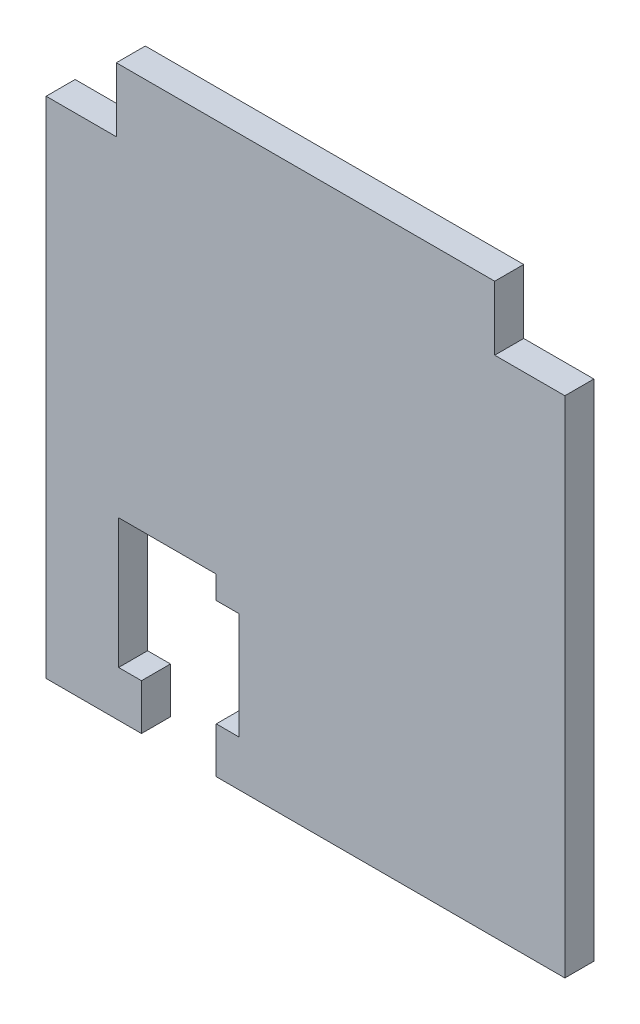
ISO-10303-21;
HEADER;
FILE_DESCRIPTION(('STEP AP214'),'2;1');
FILE_NAME('part.step','',(''),(''),'','','');
FILE_SCHEMA(('AUTOMOTIVE_DESIGN { 1 0 10303 214 1 1 1 1 }'));
ENDSEC;
DATA;
#1=APPLICATION_CONTEXT('core data for automotive mechanical design processes');
#2=APPLICATION_PROTOCOL_DEFINITION('international standard','automotive_design',2000,#1);
#3=PRODUCT_CONTEXT('',#1,'mechanical');
#4=PRODUCT('Part','Part','',(#3));
#5=PRODUCT_RELATED_PRODUCT_CATEGORY('part','',(#4));
#6=PRODUCT_DEFINITION_FORMATION('','',#4);
#7=PRODUCT_DEFINITION_CONTEXT('part definition',#1,'design');
#8=PRODUCT_DEFINITION('design','',#6,#7);
#9=PRODUCT_DEFINITION_SHAPE('','',#8);
#10=(LENGTH_UNIT() NAMED_UNIT(*) SI_UNIT(.MILLI.,.METRE.));
#11=(NAMED_UNIT(*) PLANE_ANGLE_UNIT() SI_UNIT($,.RADIAN.));
#12=(NAMED_UNIT(*) SI_UNIT($,.STERADIAN.) SOLID_ANGLE_UNIT());
#13=UNCERTAINTY_MEASURE_WITH_UNIT(LENGTH_MEASURE(1.E-05),#10,'distance_accuracy_value','');
#14=(GEOMETRIC_REPRESENTATION_CONTEXT(3) GLOBAL_UNCERTAINTY_ASSIGNED_CONTEXT((#13)) GLOBAL_UNIT_ASSIGNED_CONTEXT((#10,
#11,#12)) REPRESENTATION_CONTEXT('',''));
#15=CARTESIAN_POINT('',(0.,0.,0.));
#16=DIRECTION('',(0.,0.,1.));
#17=DIRECTION('',(1.,0.,0.));
#18=AXIS2_PLACEMENT_3D('',#15,#16,#17);
#19=CARTESIAN_POINT('',(-170.,-186.25,19.));
#20=DIRECTION('',(0.,1.,0.));
#21=DIRECTION('',(0.,0.,1.));
#22=AXIS2_PLACEMENT_3D('',#19,#20,#21);
#23=PLANE('',#22);
#24=DIRECTION('',(1.,0.,0.));
#25=VECTOR('',#24,1.);
#26=CARTESIAN_POINT('',(-170.,-186.25,19.));
#27=LINE('',#26,#25);
#28=CARTESIAN_POINT('',(-58.5,-186.25,19.));
#29=VERTEX_POINT('',#28);
#30=CARTESIAN_POINT('',(170.,-186.25,19.));
#31=VERTEX_POINT('',#30);
#32=EDGE_CURVE('E189',#29,#31,#27,.T.);
#33=ORIENTED_EDGE('',*,*,#32,.F.);
#34=DIRECTION('',(0.,0.,1.));
#35=VECTOR('',#34,1.);
#36=CARTESIAN_POINT('',(-58.5,-186.25,-0.99999999999997));
#37=LINE('',#36,#35);
#38=CARTESIAN_POINT('',(-58.5,-186.25,0.));
#39=VERTEX_POINT('',#38);
#40=EDGE_CURVE('E181',#39,#29,#37,.T.);
#41=ORIENTED_EDGE('',*,*,#40,.F.);
#42=DIRECTION('',(1.,0.,0.));
#43=VECTOR('',#42,1.);
#44=CARTESIAN_POINT('',(-170.,-186.25,0.));
#45=LINE('',#44,#43);
#46=CARTESIAN_POINT('',(170.,-186.25,0.));
#47=VERTEX_POINT('',#46);
#48=EDGE_CURVE('E206',#39,#47,#45,.T.);
#49=ORIENTED_EDGE('',*,*,#48,.T.);
#50=DIRECTION('',(0.,0.,-1.));
#51=VECTOR('',#50,1.);
#52=CARTESIAN_POINT('',(170.,-186.25,19.));
#53=LINE('',#52,#51);
#54=EDGE_CURVE('E188',#31,#47,#53,.T.);
#55=ORIENTED_EDGE('',*,*,#54,.F.);
#56=EDGE_LOOP('',(#33,#41,#49,#55));
#57=FACE_BOUND('',#56,.T.);
#58=ADVANCED_FACE('F38',(#57),#23,.F.);
#59=CARTESIAN_POINT('',(170.,-186.25,19.));
#60=DIRECTION('',(-1.,0.,0.));
#61=DIRECTION('',(0.,0.,1.));
#62=AXIS2_PLACEMENT_3D('',#59,#60,#61);
#63=PLANE('',#62);
#64=DIRECTION('',(0.,1.,0.));
#65=VECTOR('',#64,1.);
#66=CARTESIAN_POINT('',(170.,-186.25,0.));
#67=LINE('',#66,#65);
#68=CARTESIAN_POINT('',(170.,144.25,0.));
#69=VERTEX_POINT('',#68);
#70=EDGE_CURVE('E197',#47,#69,#67,.T.);
#71=ORIENTED_EDGE('',*,*,#70,.T.);
#72=DIRECTION('',(0.,0.,1.));
#73=VECTOR('',#72,1.);
#74=CARTESIAN_POINT('',(170.,144.25,0.));
#75=LINE('',#74,#73);
#76=CARTESIAN_POINT('',(170.,144.25,19.));
#77=VERTEX_POINT('',#76);
#78=EDGE_CURVE('E254',#69,#77,#75,.T.);
#79=ORIENTED_EDGE('',*,*,#78,.T.);
#80=DIRECTION('',(0.,1.,0.));
#81=VECTOR('',#80,1.);
#82=CARTESIAN_POINT('',(170.,-186.25,19.));
#83=LINE('',#82,#81);
#84=EDGE_CURVE('E207',#31,#77,#83,.T.);
#85=ORIENTED_EDGE('',*,*,#84,.F.);
#86=ORIENTED_EDGE('',*,*,#54,.T.);
#87=EDGE_LOOP('',(#71,#79,#85,#86));
#88=FACE_BOUND('',#87,.T.);
#89=ADVANCED_FACE('F40',(#88),#63,.F.);
#90=CARTESIAN_POINT('',(-170.,186.25,19.));
#91=DIRECTION('',(0.,-1.,0.));
#92=DIRECTION('',(0.,0.,-1.));
#93=AXIS2_PLACEMENT_3D('',#90,#91,#92);
#94=PLANE('',#93);
#95=DIRECTION('',(-1.,0.,0.));
#96=VECTOR('',#95,1.);
#97=CARTESIAN_POINT('',(-170.,186.25,0.));
#98=LINE('',#97,#96);
#99=CARTESIAN_POINT('',(124.,186.25,0.));
#100=VERTEX_POINT('',#99);
#101=CARTESIAN_POINT('',(-124.,186.25,0.));
#102=VERTEX_POINT('',#101);
#103=EDGE_CURVE('E200',#100,#102,#98,.T.);
#104=ORIENTED_EDGE('',*,*,#103,.T.);
#105=DIRECTION('',(0.,0.,1.));
#106=VECTOR('',#105,1.);
#107=CARTESIAN_POINT('',(-124.,186.25,0.));
#108=LINE('',#107,#106);
#109=CARTESIAN_POINT('',(-124.,186.25,19.));
#110=VERTEX_POINT('',#109);
#111=EDGE_CURVE('E201',#102,#110,#108,.T.);
#112=ORIENTED_EDGE('',*,*,#111,.T.);
#113=DIRECTION('',(-1.,0.,0.));
#114=VECTOR('',#113,1.);
#115=CARTESIAN_POINT('',(-170.,186.25,19.));
#116=LINE('',#115,#114);
#117=CARTESIAN_POINT('',(124.,186.25,19.));
#118=VERTEX_POINT('',#117);
#119=EDGE_CURVE('E290',#118,#110,#116,.T.);
#120=ORIENTED_EDGE('',*,*,#119,.F.);
#121=DIRECTION('',(0.,0.,1.));
#122=VECTOR('',#121,1.);
#123=CARTESIAN_POINT('',(124.,186.25,0.));
#124=LINE('',#123,#122);
#125=EDGE_CURVE('E273',#100,#118,#124,.T.);
#126=ORIENTED_EDGE('',*,*,#125,.F.);
#127=EDGE_LOOP('',(#104,#112,#120,#126));
#128=FACE_BOUND('',#127,.T.);
#129=ADVANCED_FACE('F298',(#128),#94,.F.);
#130=CARTESIAN_POINT('',(-170.,-186.25,19.));
#131=DIRECTION('',(1.,0.,0.));
#132=DIRECTION('',(0.,0.,-1.));
#133=AXIS2_PLACEMENT_3D('',#130,#131,#132);
#134=PLANE('',#133);
#135=DIRECTION('',(0.,-1.,0.));
#136=VECTOR('',#135,1.);
#137=CARTESIAN_POINT('',(-170.,-186.25,19.));
#138=LINE('',#137,#136);
#139=CARTESIAN_POINT('',(-170.,144.25,19.));
#140=VERTEX_POINT('',#139);
#141=CARTESIAN_POINT('',(-170.,-186.25,19.));
#142=VERTEX_POINT('',#141);
#143=EDGE_CURVE('E186',#140,#142,#138,.T.);
#144=ORIENTED_EDGE('',*,*,#143,.F.);
#145=DIRECTION('',(0.,0.,1.));
#146=VECTOR('',#145,1.);
#147=CARTESIAN_POINT('',(-170.,144.25,0.));
#148=LINE('',#147,#146);
#149=CARTESIAN_POINT('',(-170.,144.25,0.));
#150=VERTEX_POINT('',#149);
#151=EDGE_CURVE('E262',#150,#140,#148,.T.);
#152=ORIENTED_EDGE('',*,*,#151,.F.);
#153=DIRECTION('',(0.,-1.,0.));
#154=VECTOR('',#153,1.);
#155=CARTESIAN_POINT('',(-170.,-186.25,0.));
#156=LINE('',#155,#154);
#157=CARTESIAN_POINT('',(-170.,-186.25,0.));
#158=VERTEX_POINT('',#157);
#159=EDGE_CURVE('E204',#150,#158,#156,.T.);
#160=ORIENTED_EDGE('',*,*,#159,.T.);
#161=DIRECTION('',(0.,0.,-1.));
#162=VECTOR('',#161,1.);
#163=CARTESIAN_POINT('',(-170.,-186.25,19.));
#164=LINE('',#163,#162);
#165=EDGE_CURVE('E192',#142,#158,#164,.T.);
#166=ORIENTED_EDGE('',*,*,#165,.F.);
#167=EDGE_LOOP('',(#144,#152,#160,#166));
#168=FACE_BOUND('',#167,.T.);
#169=ADVANCED_FACE('F308',(#168),#134,.F.);
#170=CARTESIAN_POINT('',(-107.5,-186.25,0.));
#171=VERTEX_POINT('',#170);
#172=EDGE_CURVE('E180',#158,#171,#45,.T.);
#173=ORIENTED_EDGE('',*,*,#172,.T.);
#174=DIRECTION('',(0.,0.,1.));
#175=VECTOR('',#174,1.);
#176=CARTESIAN_POINT('',(-107.5,-186.25,-0.99999999999997));
#177=LINE('',#176,#175);
#178=CARTESIAN_POINT('',(-107.5,-186.25,19.));
#179=VERTEX_POINT('',#178);
#180=EDGE_CURVE('E164',#171,#179,#177,.T.);
#181=ORIENTED_EDGE('',*,*,#180,.T.);
#182=EDGE_CURVE('E178',#142,#179,#27,.T.);
#183=ORIENTED_EDGE('',*,*,#182,.F.);
#184=ORIENTED_EDGE('',*,*,#165,.T.);
#185=EDGE_LOOP('',(#173,#181,#183,#184));
#186=FACE_BOUND('',#185,.T.);
#187=ADVANCED_FACE('F176',(#186),#23,.F.);
#188=CARTESIAN_POINT('',(0.,0.,19.));
#189=DIRECTION('',(0.,0.,-1.));
#190=DIRECTION('',(-1.,0.,0.));
#191=AXIS2_PLACEMENT_3D('',#188,#189,#190);
#192=PLANE('',#191);
#193=DIRECTION('',(0.,-1.,0.));
#194=VECTOR('',#193,1.);
#195=CARTESIAN_POINT('',(-58.5,-171.25,19.));
#196=LINE('',#195,#194);
#197=CARTESIAN_POINT('',(-58.5,-156.25,19.));
#198=VERTEX_POINT('',#197);
#199=EDGE_CURVE('E235',#198,#29,#196,.T.);
#200=ORIENTED_EDGE('',*,*,#199,.T.);
#201=ORIENTED_EDGE('',*,*,#32,.T.);
#202=ORIENTED_EDGE('',*,*,#84,.T.);
#203=DIRECTION('',(1.,0.,0.));
#204=VECTOR('',#203,1.);
#205=CARTESIAN_POINT('',(124.,144.25,19.));
#206=LINE('',#205,#204);
#207=CARTESIAN_POINT('',(124.,144.25,19.));
#208=VERTEX_POINT('',#207);
#209=EDGE_CURVE('E280',#208,#77,#206,.T.);
#210=ORIENTED_EDGE('',*,*,#209,.F.);
#211=DIRECTION('',(0.,-1.,0.));
#212=VECTOR('',#211,1.);
#213=CARTESIAN_POINT('',(124.,186.25,19.));
#214=LINE('',#213,#212);
#215=EDGE_CURVE('E266',#118,#208,#214,.T.);
#216=ORIENTED_EDGE('',*,*,#215,.F.);
#217=ORIENTED_EDGE('',*,*,#119,.T.);
#218=DIRECTION('',(0.,1.,0.));
#219=VECTOR('',#218,1.);
#220=CARTESIAN_POINT('',(-124.,186.25,19.));
#221=LINE('',#220,#219);
#222=CARTESIAN_POINT('',(-124.,144.25,19.));
#223=VERTEX_POINT('',#222);
#224=EDGE_CURVE('E259',#223,#110,#221,.T.);
#225=ORIENTED_EDGE('',*,*,#224,.F.);
#226=DIRECTION('',(1.,0.,0.));
#227=VECTOR('',#226,1.);
#228=CARTESIAN_POINT('',(-124.,144.25,19.));
#229=LINE('',#228,#227);
#230=EDGE_CURVE('E263',#140,#223,#229,.T.);
#231=ORIENTED_EDGE('',*,*,#230,.F.);
#232=ORIENTED_EDGE('',*,*,#143,.T.);
#233=ORIENTED_EDGE('',*,*,#182,.T.);
#234=DIRECTION('',(0.,1.,0.));
#235=VECTOR('',#234,1.);
#236=CARTESIAN_POINT('',(-107.5,-171.25,19.));
#237=LINE('',#236,#235);
#238=CARTESIAN_POINT('',(-107.5,-156.25,19.));
#239=VERTEX_POINT('',#238);
#240=EDGE_CURVE('E160',#179,#239,#237,.T.);
#241=ORIENTED_EDGE('',*,*,#240,.T.);
#242=DIRECTION('',(-1.,0.,0.));
#243=VECTOR('',#242,1.);
#244=CARTESIAN_POINT('',(-122.5,-156.25,19.));
#245=LINE('',#244,#243);
#246=CARTESIAN_POINT('',(-122.5,-156.25,19.));
#247=VERTEX_POINT('',#246);
#248=EDGE_CURVE('E172',#239,#247,#245,.T.);
#249=ORIENTED_EDGE('',*,*,#248,.T.);
#250=DIRECTION('',(0.,-1.,0.));
#251=VECTOR('',#250,1.);
#252=CARTESIAN_POINT('',(-122.5,-171.25,19.));
#253=LINE('',#252,#251);
#254=CARTESIAN_POINT('',(-122.5,-71.25,19.));
#255=VERTEX_POINT('',#254);
#256=EDGE_CURVE('E244',#255,#247,#253,.T.);
#257=ORIENTED_EDGE('',*,*,#256,.F.);
#258=DIRECTION('',(-1.,0.,0.));
#259=VECTOR('',#258,1.);
#260=CARTESIAN_POINT('',(-122.5,-71.25,19.));
#261=LINE('',#260,#259);
#262=CARTESIAN_POINT('',(-58.5,-71.25,19.));
#263=VERTEX_POINT('',#262);
#264=EDGE_CURVE('E249',#263,#255,#261,.T.);
#265=ORIENTED_EDGE('',*,*,#264,.F.);
#266=DIRECTION('',(0.,-1.,0.));
#267=VECTOR('',#266,1.);
#268=CARTESIAN_POINT('',(-58.5,-71.25,19.));
#269=LINE('',#268,#267);
#270=CARTESIAN_POINT('',(-58.5,-86.25,19.));
#271=VERTEX_POINT('',#270);
#272=EDGE_CURVE('E319',#263,#271,#269,.T.);
#273=ORIENTED_EDGE('',*,*,#272,.T.);
#274=DIRECTION('',(1.,0.,0.));
#275=VECTOR('',#274,1.);
#276=CARTESIAN_POINT('',(-43.5,-86.25,19.));
#277=LINE('',#276,#275);
#278=CARTESIAN_POINT('',(-43.5,-86.25,19.));
#279=VERTEX_POINT('',#278);
#280=EDGE_CURVE('E324',#271,#279,#277,.T.);
#281=ORIENTED_EDGE('',*,*,#280,.T.);
#282=DIRECTION('',(0.,1.,0.));
#283=VECTOR('',#282,1.);
#284=CARTESIAN_POINT('',(-43.5,-171.25,19.));
#285=LINE('',#284,#283);
#286=CARTESIAN_POINT('',(-43.5,-156.25,19.));
#287=VERTEX_POINT('',#286);
#288=EDGE_CURVE('E247',#287,#279,#285,.T.);
#289=ORIENTED_EDGE('',*,*,#288,.F.);
#290=DIRECTION('',(-1.,0.,0.));
#291=VECTOR('',#290,1.);
#292=CARTESIAN_POINT('',(-43.5,-156.25,19.));
#293=LINE('',#292,#291);
#294=EDGE_CURVE('E171',#287,#198,#293,.T.);
#295=ORIENTED_EDGE('',*,*,#294,.T.);
#296=EDGE_LOOP('',(#200,#201,#202,#210,#216,#217,#225,#231,#232,#233,#241,#249,#257,#265,#273,
#281,#289,#295));
#297=FACE_BOUND('',#296,.T.);
#298=ADVANCED_FACE('F183',(#297),#192,.F.);
#299=CARTESIAN_POINT('',(0.,0.,0.));
#300=DIRECTION('',(0.,0.,-1.));
#301=DIRECTION('',(-1.,0.,0.));
#302=AXIS2_PLACEMENT_3D('',#299,#300,#301);
#303=PLANE('',#302);
#304=ORIENTED_EDGE('',*,*,#48,.F.);
#305=DIRECTION('',(0.,-1.,0.));
#306=VECTOR('',#305,1.);
#307=CARTESIAN_POINT('',(-58.5,-171.25,0.));
#308=LINE('',#307,#306);
#309=CARTESIAN_POINT('',(-58.5,-156.25,0.));
#310=VERTEX_POINT('',#309);
#311=EDGE_CURVE('E230',#310,#39,#308,.T.);
#312=ORIENTED_EDGE('',*,*,#311,.F.);
#313=DIRECTION('',(-1.,0.,0.));
#314=VECTOR('',#313,1.);
#315=CARTESIAN_POINT('',(-43.5,-156.25,0.));
#316=LINE('',#315,#314);
#317=CARTESIAN_POINT('',(-43.5,-156.25,0.));
#318=VERTEX_POINT('',#317);
#319=EDGE_CURVE('E227',#318,#310,#316,.T.);
#320=ORIENTED_EDGE('',*,*,#319,.F.);
#321=DIRECTION('',(0.,-1.,0.));
#322=VECTOR('',#321,1.);
#323=CARTESIAN_POINT('',(-43.5,0.,0.));
#324=LINE('',#323,#322);
#325=CARTESIAN_POINT('',(-43.5,-86.25,0.));
#326=VERTEX_POINT('',#325);
#327=EDGE_CURVE('E210',#326,#318,#324,.T.);
#328=ORIENTED_EDGE('',*,*,#327,.F.);
#329=DIRECTION('',(1.,0.,0.));
#330=VECTOR('',#329,1.);
#331=CARTESIAN_POINT('',(-43.5,-86.25,0.));
#332=LINE('',#331,#330);
#333=CARTESIAN_POINT('',(-58.5,-86.25,0.));
#334=VERTEX_POINT('',#333);
#335=EDGE_CURVE('E325',#334,#326,#332,.T.);
#336=ORIENTED_EDGE('',*,*,#335,.F.);
#337=DIRECTION('',(0.,-1.,0.));
#338=VECTOR('',#337,1.);
#339=CARTESIAN_POINT('',(-58.5,-71.25,0.));
#340=LINE('',#339,#338);
#341=CARTESIAN_POINT('',(-58.5,-71.25,0.));
#342=VERTEX_POINT('',#341);
#343=EDGE_CURVE('E321',#342,#334,#340,.T.);
#344=ORIENTED_EDGE('',*,*,#343,.F.);
#345=DIRECTION('',(1.,0.,0.));
#346=VECTOR('',#345,1.);
#347=CARTESIAN_POINT('',(0.,-71.25,0.));
#348=LINE('',#347,#346);
#349=CARTESIAN_POINT('',(-122.5,-71.25,0.));
#350=VERTEX_POINT('',#349);
#351=EDGE_CURVE('E46',#350,#342,#348,.T.);
#352=ORIENTED_EDGE('',*,*,#351,.F.);
#353=DIRECTION('',(0.,1.,0.));
#354=VECTOR('',#353,1.);
#355=CARTESIAN_POINT('',(-122.5,0.,0.));
#356=LINE('',#355,#354);
#357=CARTESIAN_POINT('',(-122.5,-156.25,0.));
#358=VERTEX_POINT('',#357);
#359=EDGE_CURVE('E11',#358,#350,#356,.T.);
#360=ORIENTED_EDGE('',*,*,#359,.F.);
#361=DIRECTION('',(-1.,0.,0.));
#362=VECTOR('',#361,1.);
#363=CARTESIAN_POINT('',(-122.5,-156.25,0.));
#364=LINE('',#363,#362);
#365=CARTESIAN_POINT('',(-107.5,-156.25,0.));
#366=VERTEX_POINT('',#365);
#367=EDGE_CURVE('E312',#366,#358,#364,.T.);
#368=ORIENTED_EDGE('',*,*,#367,.F.);
#369=DIRECTION('',(0.,1.,0.));
#370=VECTOR('',#369,1.);
#371=CARTESIAN_POINT('',(-107.5,-171.25,0.));
#372=LINE('',#371,#370);
#373=EDGE_CURVE('E240',#171,#366,#372,.T.);
#374=ORIENTED_EDGE('',*,*,#373,.F.);
#375=ORIENTED_EDGE('',*,*,#172,.F.);
#376=ORIENTED_EDGE('',*,*,#159,.F.);
#377=DIRECTION('',(1.,0.,0.));
#378=VECTOR('',#377,1.);
#379=CARTESIAN_POINT('',(-124.,144.25,0.));
#380=LINE('',#379,#378);
#381=CARTESIAN_POINT('',(-124.,144.25,0.));
#382=VERTEX_POINT('',#381);
#383=EDGE_CURVE('E255',#150,#382,#380,.T.);
#384=ORIENTED_EDGE('',*,*,#383,.T.);
#385=DIRECTION('',(0.,1.,0.));
#386=VECTOR('',#385,1.);
#387=CARTESIAN_POINT('',(-124.,186.25,0.));
#388=LINE('',#387,#386);
#389=EDGE_CURVE('E258',#382,#102,#388,.T.);
#390=ORIENTED_EDGE('',*,*,#389,.T.);
#391=ORIENTED_EDGE('',*,*,#103,.F.);
#392=DIRECTION('',(0.,-1.,0.));
#393=VECTOR('',#392,1.);
#394=CARTESIAN_POINT('',(124.,186.25,0.));
#395=LINE('',#394,#393);
#396=CARTESIAN_POINT('',(124.,144.25,0.));
#397=VERTEX_POINT('',#396);
#398=EDGE_CURVE('E282',#100,#397,#395,.T.);
#399=ORIENTED_EDGE('',*,*,#398,.T.);
#400=DIRECTION('',(1.,0.,0.));
#401=VECTOR('',#400,1.);
#402=CARTESIAN_POINT('',(124.,144.25,0.));
#403=LINE('',#402,#401);
#404=EDGE_CURVE('E275',#397,#69,#403,.T.);
#405=ORIENTED_EDGE('',*,*,#404,.T.);
#406=ORIENTED_EDGE('',*,*,#70,.F.);
#407=EDGE_LOOP('',(#304,#312,#320,#328,#336,#344,#352,#360,#368,#374,#375,#376,#384,#390,#391,
#399,#405,#406));
#408=FACE_BOUND('',#407,.T.);
#409=ADVANCED_FACE('F234',(#408),#303,.T.);
#410=CARTESIAN_POINT('',(124.,144.25,0.));
#411=DIRECTION('',(0.,-1.,0.));
#412=DIRECTION('',(0.,0.,-1.));
#413=AXIS2_PLACEMENT_3D('',#410,#411,#412);
#414=PLANE('',#413);
#415=ORIENTED_EDGE('',*,*,#209,.T.);
#416=ORIENTED_EDGE('',*,*,#78,.F.);
#417=ORIENTED_EDGE('',*,*,#404,.F.);
#418=DIRECTION('',(0.,0.,1.));
#419=VECTOR('',#418,1.);
#420=CARTESIAN_POINT('',(124.,144.25,0.));
#421=LINE('',#420,#419);
#422=EDGE_CURVE('E276',#397,#208,#421,.T.);
#423=ORIENTED_EDGE('',*,*,#422,.T.);
#424=EDGE_LOOP('',(#415,#416,#417,#423));
#425=FACE_BOUND('',#424,.T.);
#426=ADVANCED_FACE('F431',(#425),#414,.F.);
#427=CARTESIAN_POINT('',(124.,186.25,0.));
#428=DIRECTION('',(-1.,0.,0.));
#429=DIRECTION('',(0.,0.,1.));
#430=AXIS2_PLACEMENT_3D('',#427,#428,#429);
#431=PLANE('',#430);
#432=ORIENTED_EDGE('',*,*,#215,.T.);
#433=ORIENTED_EDGE('',*,*,#422,.F.);
#434=ORIENTED_EDGE('',*,*,#398,.F.);
#435=ORIENTED_EDGE('',*,*,#125,.T.);
#436=EDGE_LOOP('',(#432,#433,#434,#435));
#437=FACE_BOUND('',#436,.T.);
#438=ADVANCED_FACE('F441',(#437),#431,.F.);
#439=CARTESIAN_POINT('',(-124.,186.25,0.));
#440=DIRECTION('',(1.,0.,0.));
#441=DIRECTION('',(0.,0.,-1.));
#442=AXIS2_PLACEMENT_3D('',#439,#440,#441);
#443=PLANE('',#442);
#444=ORIENTED_EDGE('',*,*,#224,.T.);
#445=ORIENTED_EDGE('',*,*,#111,.F.);
#446=ORIENTED_EDGE('',*,*,#389,.F.);
#447=DIRECTION('',(0.,0.,1.));
#448=VECTOR('',#447,1.);
#449=CARTESIAN_POINT('',(-124.,144.25,0.));
#450=LINE('',#449,#448);
#451=EDGE_CURVE('E270',#382,#223,#450,.T.);
#452=ORIENTED_EDGE('',*,*,#451,.T.);
#453=EDGE_LOOP('',(#444,#445,#446,#452));
#454=FACE_BOUND('',#453,.T.);
#455=ADVANCED_FACE('F301',(#454),#443,.F.);
#456=CARTESIAN_POINT('',(-124.,144.25,0.));
#457=DIRECTION('',(0.,-1.,0.));
#458=DIRECTION('',(0.,0.,-1.));
#459=AXIS2_PLACEMENT_3D('',#456,#457,#458);
#460=PLANE('',#459);
#461=ORIENTED_EDGE('',*,*,#230,.T.);
#462=ORIENTED_EDGE('',*,*,#451,.F.);
#463=ORIENTED_EDGE('',*,*,#383,.F.);
#464=ORIENTED_EDGE('',*,*,#151,.T.);
#465=EDGE_LOOP('',(#461,#462,#463,#464));
#466=FACE_BOUND('',#465,.T.);
#467=ADVANCED_FACE('F306',(#466),#460,.F.);
#468=CARTESIAN_POINT('',(-122.5,-171.25,-11.));
#469=DIRECTION('',(-1.,0.,0.));
#470=DIRECTION('',(0.,0.,1.));
#471=AXIS2_PLACEMENT_3D('',#468,#469,#470);
#472=PLANE('',#471);
#473=ORIENTED_EDGE('',*,*,#256,.T.);
#474=DIRECTION('',(0.,0.,1.));
#475=VECTOR('',#474,1.);
#476=CARTESIAN_POINT('',(-122.5,-156.25,0.));
#477=LINE('',#476,#475);
#478=EDGE_CURVE('E316',#358,#247,#477,.T.);
#479=ORIENTED_EDGE('',*,*,#478,.F.);
#480=ORIENTED_EDGE('',*,*,#359,.T.);
#481=DIRECTION('',(0.,0.,1.));
#482=VECTOR('',#481,1.);
#483=CARTESIAN_POINT('',(-122.5,-71.25,-11.));
#484=LINE('',#483,#482);
#485=EDGE_CURVE('E251',#350,#255,#484,.T.);
#486=ORIENTED_EDGE('',*,*,#485,.T.);
#487=EDGE_LOOP('',(#473,#479,#480,#486));
#488=FACE_BOUND('',#487,.T.);
#489=ADVANCED_FACE('F354',(#488),#472,.F.);
#490=CARTESIAN_POINT('',(-122.5,-71.25,-11.));
#491=DIRECTION('',(0.,1.,0.));
#492=DIRECTION('',(0.,0.,1.));
#493=AXIS2_PLACEMENT_3D('',#490,#491,#492);
#494=PLANE('',#493);
#495=ORIENTED_EDGE('',*,*,#351,.T.);
#496=DIRECTION('',(0.,0.,1.));
#497=VECTOR('',#496,1.);
#498=CARTESIAN_POINT('',(-58.5,-71.25,0.));
#499=LINE('',#498,#497);
#500=EDGE_CURVE('E53',#342,#263,#499,.T.);
#501=ORIENTED_EDGE('',*,*,#500,.T.);
#502=ORIENTED_EDGE('',*,*,#264,.T.);
#503=ORIENTED_EDGE('',*,*,#485,.F.);
#504=EDGE_LOOP('',(#495,#501,#502,#503));
#505=FACE_BOUND('',#504,.T.);
#506=ADVANCED_FACE('F352',(#505),#494,.F.);
#507=CARTESIAN_POINT('',(-43.5,-171.25,-11.));
#508=DIRECTION('',(1.,0.,0.));
#509=DIRECTION('',(0.,0.,-1.));
#510=AXIS2_PLACEMENT_3D('',#507,#508,#509);
#511=PLANE('',#510);
#512=ORIENTED_EDGE('',*,*,#288,.T.);
#513=DIRECTION('',(0.,0.,1.));
#514=VECTOR('',#513,1.);
#515=CARTESIAN_POINT('',(-43.5,-86.25,0.));
#516=LINE('',#515,#514);
#517=EDGE_CURVE('E218',#326,#279,#516,.T.);
#518=ORIENTED_EDGE('',*,*,#517,.F.);
#519=ORIENTED_EDGE('',*,*,#327,.T.);
#520=DIRECTION('',(0.,0.,1.));
#521=VECTOR('',#520,1.);
#522=CARTESIAN_POINT('',(-43.5,-156.25,0.));
#523=LINE('',#522,#521);
#524=EDGE_CURVE('E215',#318,#287,#523,.T.);
#525=ORIENTED_EDGE('',*,*,#524,.T.);
#526=EDGE_LOOP('',(#512,#518,#519,#525));
#527=FACE_BOUND('',#526,.T.);
#528=ADVANCED_FACE('F214',(#527),#511,.F.);
#529=CARTESIAN_POINT('',(-58.5,-171.25,0.));
#530=DIRECTION('',(-1.,0.,0.));
#531=DIRECTION('',(0.,0.,1.));
#532=AXIS2_PLACEMENT_3D('',#529,#530,#531);
#533=PLANE('',#532);
#534=ORIENTED_EDGE('',*,*,#199,.F.);
#535=DIRECTION('',(0.,0.,1.));
#536=VECTOR('',#535,1.);
#537=CARTESIAN_POINT('',(-58.5,-156.25,0.));
#538=LINE('',#537,#536);
#539=EDGE_CURVE('E229',#310,#198,#538,.T.);
#540=ORIENTED_EDGE('',*,*,#539,.F.);
#541=ORIENTED_EDGE('',*,*,#311,.T.);
#542=ORIENTED_EDGE('',*,*,#40,.T.);
#543=EDGE_LOOP('',(#534,#540,#541,#542));
#544=FACE_BOUND('',#543,.T.);
#545=ADVANCED_FACE('F340',(#544),#533,.T.);
#546=CARTESIAN_POINT('',(-43.5,-156.25,0.));
#547=DIRECTION('',(0.,1.,0.));
#548=DIRECTION('',(0.,0.,1.));
#549=AXIS2_PLACEMENT_3D('',#546,#547,#548);
#550=PLANE('',#549);
#551=ORIENTED_EDGE('',*,*,#294,.F.);
#552=ORIENTED_EDGE('',*,*,#524,.F.);
#553=ORIENTED_EDGE('',*,*,#319,.T.);
#554=ORIENTED_EDGE('',*,*,#539,.T.);
#555=EDGE_LOOP('',(#551,#552,#553,#554));
#556=FACE_BOUND('',#555,.T.);
#557=ADVANCED_FACE('F226',(#556),#550,.T.);
#558=CARTESIAN_POINT('',(-122.5,-156.25,0.));
#559=DIRECTION('',(0.,1.,0.));
#560=DIRECTION('',(0.,0.,1.));
#561=AXIS2_PLACEMENT_3D('',#558,#559,#560);
#562=PLANE('',#561);
#563=ORIENTED_EDGE('',*,*,#248,.F.);
#564=DIRECTION('',(0.,0.,1.));
#565=VECTOR('',#564,1.);
#566=CARTESIAN_POINT('',(-107.5,-156.25,0.));
#567=LINE('',#566,#565);
#568=EDGE_CURVE('E166',#366,#239,#567,.T.);
#569=ORIENTED_EDGE('',*,*,#568,.F.);
#570=ORIENTED_EDGE('',*,*,#367,.T.);
#571=ORIENTED_EDGE('',*,*,#478,.T.);
#572=EDGE_LOOP('',(#563,#569,#570,#571));
#573=FACE_BOUND('',#572,.T.);
#574=ADVANCED_FACE('F355',(#573),#562,.T.);
#575=CARTESIAN_POINT('',(-107.5,-171.25,0.));
#576=DIRECTION('',(1.,0.,0.));
#577=DIRECTION('',(0.,0.,-1.));
#578=AXIS2_PLACEMENT_3D('',#575,#576,#577);
#579=PLANE('',#578);
#580=ORIENTED_EDGE('',*,*,#240,.F.);
#581=ORIENTED_EDGE('',*,*,#180,.F.);
#582=ORIENTED_EDGE('',*,*,#373,.T.);
#583=ORIENTED_EDGE('',*,*,#568,.T.);
#584=EDGE_LOOP('',(#580,#581,#582,#583));
#585=FACE_BOUND('',#584,.T.);
#586=ADVANCED_FACE('F162',(#585),#579,.T.);
#587=CARTESIAN_POINT('',(-43.5,-86.25,0.));
#588=DIRECTION('',(0.,-1.,0.));
#589=DIRECTION('',(1.,0.,0.));
#590=AXIS2_PLACEMENT_3D('',#587,#588,#589);
#591=PLANE('',#590);
#592=ORIENTED_EDGE('',*,*,#280,.F.);
#593=DIRECTION('',(0.,0.,1.));
#594=VECTOR('',#593,1.);
#595=CARTESIAN_POINT('',(-58.5,-86.25,0.));
#596=LINE('',#595,#594);
#597=EDGE_CURVE('E332',#334,#271,#596,.T.);
#598=ORIENTED_EDGE('',*,*,#597,.F.);
#599=ORIENTED_EDGE('',*,*,#335,.T.);
#600=ORIENTED_EDGE('',*,*,#517,.T.);
#601=EDGE_LOOP('',(#592,#598,#599,#600));
#602=FACE_BOUND('',#601,.T.);
#603=ADVANCED_FACE('F346',(#602),#591,.T.);
#604=CARTESIAN_POINT('',(-58.5,-71.25,0.));
#605=DIRECTION('',(-1.,0.,0.));
#606=DIRECTION('',(0.,0.,1.));
#607=AXIS2_PLACEMENT_3D('',#604,#605,#606);
#608=PLANE('',#607);
#609=ORIENTED_EDGE('',*,*,#272,.F.);
#610=ORIENTED_EDGE('',*,*,#500,.F.);
#611=ORIENTED_EDGE('',*,*,#343,.T.);
#612=ORIENTED_EDGE('',*,*,#597,.T.);
#613=EDGE_LOOP('',(#609,#610,#611,#612));
#614=FACE_BOUND('',#613,.T.);
#615=ADVANCED_FACE('F350',(#614),#608,.T.);
#616=CLOSED_SHELL('',(#58,#89,#129,#169,#187,#298,#409,#426,#438,#455,#467,#489,#506,#528,#545,
#557,#574,#586,#603,#615));
#617=MANIFOLD_SOLID_BREP('B2',#616);
#618=ADVANCED_BREP_SHAPE_REPRESENTATION('',(#18,#617),#14);
#619=SHAPE_DEFINITION_REPRESENTATION(#9,#618);
ENDSEC;
END-ISO-10303-21;
